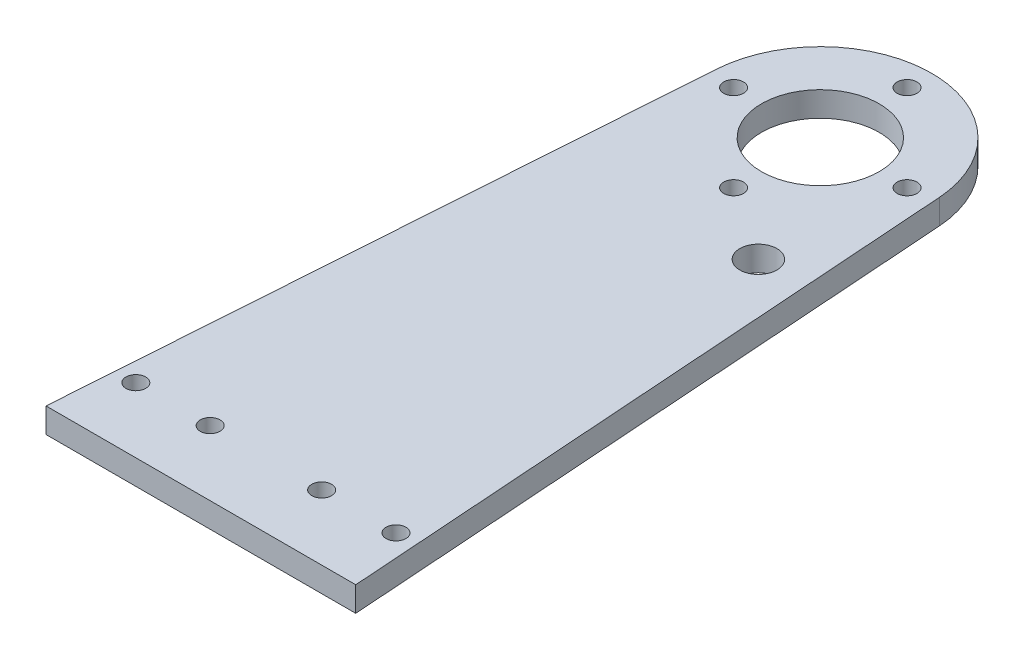
ISO-10303-21;
HEADER;
FILE_DESCRIPTION(('STEP AP214'),'2;1');
FILE_NAME('part.step','',(''),(''),'','','');
FILE_SCHEMA(('AUTOMOTIVE_DESIGN { 1 0 10303 214 1 1 1 1 }'));
ENDSEC;
DATA;
#1=APPLICATION_CONTEXT('core data for automotive mechanical design processes');
#2=APPLICATION_PROTOCOL_DEFINITION('international standard','automotive_design',2000,#1);
#3=PRODUCT_CONTEXT('',#1,'mechanical');
#4=PRODUCT('Part','Part','',(#3));
#5=PRODUCT_RELATED_PRODUCT_CATEGORY('part','',(#4));
#6=PRODUCT_DEFINITION_FORMATION('','',#4);
#7=PRODUCT_DEFINITION_CONTEXT('part definition',#1,'design');
#8=PRODUCT_DEFINITION('design','',#6,#7);
#9=PRODUCT_DEFINITION_SHAPE('','',#8);
#10=(LENGTH_UNIT() NAMED_UNIT(*) SI_UNIT(.MILLI.,.METRE.));
#11=(NAMED_UNIT(*) PLANE_ANGLE_UNIT() SI_UNIT($,.RADIAN.));
#12=(NAMED_UNIT(*) SI_UNIT($,.STERADIAN.) SOLID_ANGLE_UNIT());
#13=UNCERTAINTY_MEASURE_WITH_UNIT(LENGTH_MEASURE(1.E-05),#10,'distance_accuracy_value','');
#14=(GEOMETRIC_REPRESENTATION_CONTEXT(3) GLOBAL_UNCERTAINTY_ASSIGNED_CONTEXT((#13)) GLOBAL_UNIT_ASSIGNED_CONTEXT((#10,
#11,#12)) REPRESENTATION_CONTEXT('',''));
#15=CARTESIAN_POINT('',(0.,0.,0.));
#16=DIRECTION('',(0.,0.,1.));
#17=DIRECTION('',(1.,0.,0.));
#18=AXIS2_PLACEMENT_3D('',#15,#16,#17);
#19=CARTESIAN_POINT('',(0.,4.,0.));
#20=DIRECTION('',(0.,1.,0.));
#21=DIRECTION('',(0.,0.,1.));
#22=AXIS2_PLACEMENT_3D('',#19,#20,#21);
#23=PLANE('',#22);
#24=CARTESIAN_POINT('',(-9.00000000000125,4.,89.5));
#25=DIRECTION('',(0.,1.,0.));
#26=DIRECTION('',(0.,0.,1.));
#27=AXIS2_PLACEMENT_3D('',#24,#25,#26);
#28=CIRCLE('',#27,1.59999999999982);
#29=CARTESIAN_POINT('',(-9.00000000000125,4.,91.0999999999999));
#30=VERTEX_POINT('',#29);
#31=EDGE_CURVE('E158',#30,#30,#28,.T.);
#32=ORIENTED_EDGE('',*,*,#31,.F.);
#33=EDGE_LOOP('',(#32));
#34=FACE_BOUND('',#33,.T.);
#35=CARTESIAN_POINT('',(20.9999999999977,4.,89.5));
#36=DIRECTION('',(0.,1.,0.));
#37=DIRECTION('',(0.,0.,1.));
#38=AXIS2_PLACEMENT_3D('',#35,#36,#37);
#39=CIRCLE('',#38,1.59999999999982);
#40=CARTESIAN_POINT('',(20.9999999999977,4.,91.0999999999999));
#41=VERTEX_POINT('',#40);
#42=EDGE_CURVE('E146',#41,#41,#39,.T.);
#43=ORIENTED_EDGE('',*,*,#42,.F.);
#44=EDGE_LOOP('',(#43));
#45=FACE_BOUND('',#44,.T.);
#46=CARTESIAN_POINT('',(-1.34766330039948E-12,4.,-14.));
#47=DIRECTION('',(0.,1.,0.));
#48=DIRECTION('',(0.,0.,1.));
#49=AXIS2_PLACEMENT_3D('',#46,#47,#48);
#50=CIRCLE('',#49,1.59999999999982);
#51=CARTESIAN_POINT('',(-1.34766330039948E-12,4.,-12.4000000000002));
#52=VERTEX_POINT('',#51);
#53=EDGE_CURVE('E134',#52,#52,#50,.T.);
#54=ORIENTED_EDGE('',*,*,#53,.F.);
#55=EDGE_LOOP('',(#54));
#56=FACE_BOUND('',#55,.T.);
#57=CARTESIAN_POINT('',(-4.59484880699357E-13,4.,14.));
#58=DIRECTION('',(0.,1.,0.));
#59=DIRECTION('',(0.,0.,1.));
#60=AXIS2_PLACEMENT_3D('',#57,#58,#59);
#61=CIRCLE('',#60,1.59999999999982);
#62=CARTESIAN_POINT('',(-4.59484880699357E-13,4.,15.5999999999998));
#63=VERTEX_POINT('',#62);
#64=EDGE_CURVE('E122',#63,#63,#61,.T.);
#65=ORIENTED_EDGE('',*,*,#64,.F.);
#66=EDGE_LOOP('',(#65));
#67=FACE_BOUND('',#66,.T.);
#68=CARTESIAN_POINT('',(0.,4.,0.));
#69=DIRECTION('',(0.,1.,0.));
#70=DIRECTION('',(0.,0.,1.));
#71=AXIS2_PLACEMENT_3D('',#68,#69,#70);
#72=CIRCLE('',#71,9.49999999999872);
#73=CARTESIAN_POINT('',(0.,4.,9.49999999999872));
#74=VERTEX_POINT('',#73);
#75=EDGE_CURVE('E101',#74,#74,#72,.T.);
#76=ORIENTED_EDGE('',*,*,#75,.F.);
#77=EDGE_LOOP('',(#76));
#78=FACE_BOUND('',#77,.T.);
#79=CARTESIAN_POINT('',(0.,4.,0.));
#80=DIRECTION('',(0.,1.,0.));
#81=DIRECTION('',(0.,0.,1.));
#82=AXIS2_PLACEMENT_3D('',#79,#80,#81);
#83=CIRCLE('',#82,18.000000000004);
#84=CARTESIAN_POINT('',(17.9566038512915,4.,-1.2491509628253));
#85=VERTEX_POINT('',#84);
#86=CARTESIAN_POINT('',(-17.9566038512915,4.,-1.24915096282486));
#87=VERTEX_POINT('',#86);
#88=EDGE_CURVE('E86',#85,#87,#83,.T.);
#89=ORIENTED_EDGE('',*,*,#88,.T.);
#90=DIRECTION('',(-0.0693972757123029,0.,0.99758910284932));
#91=VECTOR('',#90,1.);
#92=CARTESIAN_POINT('',(-17.9566038512915,4.,-1.24915096282486));
#93=LINE('',#92,#91);
#94=CARTESIAN_POINT('',(-25.0000000000013,4.,99.9999999999996));
#95=VERTEX_POINT('',#94);
#96=EDGE_CURVE('E81',#87,#95,#93,.T.);
#97=ORIENTED_EDGE('',*,*,#96,.T.);
#98=DIRECTION('',(1.,0.,0.));
#99=VECTOR('',#98,1.);
#100=CARTESIAN_POINT('',(-25.0000000000013,4.,99.9999999999996));
#101=LINE('',#100,#99);
#102=CARTESIAN_POINT('',(24.9999999999995,4.,99.9999999999996));
#103=VERTEX_POINT('',#102);
#104=EDGE_CURVE('E84',#95,#103,#101,.T.);
#105=ORIENTED_EDGE('',*,*,#104,.T.);
#106=DIRECTION('',(-0.0693972757122852,0.,-0.997589102849321));
#107=VECTOR('',#106,1.);
#108=CARTESIAN_POINT('',(17.9566038512915,4.,-1.2491509628253));
#109=LINE('',#108,#107);
#110=EDGE_CURVE('E51',#103,#85,#109,.T.);
#111=ORIENTED_EDGE('',*,*,#110,.T.);
#112=EDGE_LOOP('',(#89,#97,#105,#111));
#113=FACE_BOUND('',#112,.T.);
#114=CARTESIAN_POINT('',(-14.0000000000007,4.,4.37150315946155E-13));
#115=DIRECTION('',(0.,1.,0.));
#116=DIRECTION('',(0.,0.,1.));
#117=AXIS2_PLACEMENT_3D('',#114,#115,#116);
#118=CIRCLE('',#117,1.59999999999982);
#119=CARTESIAN_POINT('',(-14.0000000000007,4.,1.60000000000026));
#120=VERTEX_POINT('',#119);
#121=EDGE_CURVE('E116',#120,#120,#118,.T.);
#122=ORIENTED_EDGE('',*,*,#121,.F.);
#123=EDGE_LOOP('',(#122));
#124=FACE_BOUND('',#123,.T.);
#125=CARTESIAN_POINT('',(13.9999999999993,4.,-4.5102810375397E-13));
#126=DIRECTION('',(0.,1.,0.));
#127=DIRECTION('',(0.,0.,1.));
#128=AXIS2_PLACEMENT_3D('',#125,#126,#127);
#129=CIRCLE('',#128,1.59999999999982);
#130=CARTESIAN_POINT('',(13.9999999999993,4.,1.59999999999937));
#131=VERTEX_POINT('',#130);
#132=EDGE_CURVE('E128',#131,#131,#129,.T.);
#133=ORIENTED_EDGE('',*,*,#132,.F.);
#134=EDGE_LOOP('',(#133));
#135=FACE_BOUND('',#134,.T.);
#136=CARTESIAN_POINT('',(8.99999999999944,4.,89.5));
#137=DIRECTION('',(0.,1.,0.));
#138=DIRECTION('',(0.,0.,1.));
#139=AXIS2_PLACEMENT_3D('',#136,#137,#138);
#140=CIRCLE('',#139,1.59999999999982);
#141=CARTESIAN_POINT('',(8.99999999999944,4.,91.0999999999999));
#142=VERTEX_POINT('',#141);
#143=EDGE_CURVE('E140',#142,#142,#140,.T.);
#144=ORIENTED_EDGE('',*,*,#143,.F.);
#145=EDGE_LOOP('',(#144));
#146=FACE_BOUND('',#145,.T.);
#147=CARTESIAN_POINT('',(-21.0000000000021,4.,89.5));
#148=DIRECTION('',(0.,1.,0.));
#149=DIRECTION('',(0.,0.,1.));
#150=AXIS2_PLACEMENT_3D('',#147,#148,#149);
#151=CIRCLE('',#150,1.59999999999982);
#152=CARTESIAN_POINT('',(-21.0000000000021,4.,91.0999999999999));
#153=VERTEX_POINT('',#152);
#154=EDGE_CURVE('E152',#153,#153,#151,.T.);
#155=ORIENTED_EDGE('',*,*,#154,.F.);
#156=EDGE_LOOP('',(#155));
#157=FACE_BOUND('',#156,.T.);
#158=CARTESIAN_POINT('',(11.9999999999996,4.,22.));
#159=DIRECTION('',(0.,1.,0.));
#160=DIRECTION('',(0.,0.,1.));
#161=AXIS2_PLACEMENT_3D('',#158,#159,#160);
#162=CIRCLE('',#161,3.00000000000011);
#163=CARTESIAN_POINT('',(11.9999999999996,4.,25.0000000000001));
#164=VERTEX_POINT('',#163);
#165=EDGE_CURVE('E164',#164,#164,#162,.T.);
#166=ORIENTED_EDGE('',*,*,#165,.F.);
#167=EDGE_LOOP('',(#166));
#168=FACE_BOUND('',#167,.T.);
#169=ADVANCED_FACE('F34',(#34,#45,#56,#67,#78,#113,#124,#135,#146,#157,#168),#23,.T.);
#170=CARTESIAN_POINT('',(0.,0.,0.));
#171=DIRECTION('',(0.,1.,0.));
#172=DIRECTION('',(0.,0.,1.));
#173=AXIS2_PLACEMENT_3D('',#170,#171,#172);
#174=PLANE('',#173);
#175=CARTESIAN_POINT('',(0.,0.,0.));
#176=DIRECTION('',(0.,1.,0.));
#177=DIRECTION('',(0.,0.,1.));
#178=AXIS2_PLACEMENT_3D('',#175,#176,#177);
#179=CIRCLE('',#178,18.000000000004);
#180=CARTESIAN_POINT('',(17.9566038512915,0.,-1.2491509628253));
#181=VERTEX_POINT('',#180);
#182=CARTESIAN_POINT('',(-17.9566038512915,0.,-1.24915096282486));
#183=VERTEX_POINT('',#182);
#184=EDGE_CURVE('E98',#181,#183,#179,.T.);
#185=ORIENTED_EDGE('',*,*,#184,.F.);
#186=DIRECTION('',(-0.0693972757122852,0.,-0.997589102849321));
#187=VECTOR('',#186,1.);
#188=CARTESIAN_POINT('',(17.9566038512915,0.,-1.2491509628253));
#189=LINE('',#188,#187);
#190=CARTESIAN_POINT('',(24.9999999999995,0.,99.9999999999996));
#191=VERTEX_POINT('',#190);
#192=EDGE_CURVE('E74',#191,#181,#189,.T.);
#193=ORIENTED_EDGE('',*,*,#192,.F.);
#194=DIRECTION('',(1.,0.,0.));
#195=VECTOR('',#194,1.);
#196=CARTESIAN_POINT('',(-25.0000000000013,0.,99.9999999999996));
#197=LINE('',#196,#195);
#198=CARTESIAN_POINT('',(-25.0000000000013,0.,99.9999999999996));
#199=VERTEX_POINT('',#198);
#200=EDGE_CURVE('E68',#199,#191,#197,.T.);
#201=ORIENTED_EDGE('',*,*,#200,.F.);
#202=DIRECTION('',(-0.0693972757123029,0.,0.99758910284932));
#203=VECTOR('',#202,1.);
#204=CARTESIAN_POINT('',(-17.9566038512915,0.,-1.24915096282486));
#205=LINE('',#204,#203);
#206=EDGE_CURVE('E90',#183,#199,#205,.T.);
#207=ORIENTED_EDGE('',*,*,#206,.F.);
#208=EDGE_LOOP('',(#185,#193,#201,#207));
#209=FACE_BOUND('',#208,.T.);
#210=CARTESIAN_POINT('',(0.,0.,0.));
#211=DIRECTION('',(0.,1.,0.));
#212=DIRECTION('',(0.,0.,1.));
#213=AXIS2_PLACEMENT_3D('',#210,#211,#212);
#214=CIRCLE('',#213,9.49999999999872);
#215=CARTESIAN_POINT('',(0.,0.,9.49999999999872));
#216=VERTEX_POINT('',#215);
#217=EDGE_CURVE('E113',#216,#216,#214,.T.);
#218=ORIENTED_EDGE('',*,*,#217,.T.);
#219=EDGE_LOOP('',(#218));
#220=FACE_BOUND('',#219,.T.);
#221=CARTESIAN_POINT('',(-14.0000000000007,0.,4.37150315946155E-13));
#222=DIRECTION('',(0.,1.,0.));
#223=DIRECTION('',(0.,0.,1.));
#224=AXIS2_PLACEMENT_3D('',#221,#222,#223);
#225=CIRCLE('',#224,1.59999999999982);
#226=CARTESIAN_POINT('',(-14.0000000000007,0.,1.60000000000026));
#227=VERTEX_POINT('',#226);
#228=EDGE_CURVE('E119',#227,#227,#225,.T.);
#229=ORIENTED_EDGE('',*,*,#228,.T.);
#230=EDGE_LOOP('',(#229));
#231=FACE_BOUND('',#230,.T.);
#232=CARTESIAN_POINT('',(-4.59484880699357E-13,0.,14.));
#233=DIRECTION('',(0.,1.,0.));
#234=DIRECTION('',(0.,0.,1.));
#235=AXIS2_PLACEMENT_3D('',#232,#233,#234);
#236=CIRCLE('',#235,1.59999999999982);
#237=CARTESIAN_POINT('',(-4.59484880699357E-13,0.,15.5999999999998));
#238=VERTEX_POINT('',#237);
#239=EDGE_CURVE('E125',#238,#238,#236,.T.);
#240=ORIENTED_EDGE('',*,*,#239,.T.);
#241=EDGE_LOOP('',(#240));
#242=FACE_BOUND('',#241,.T.);
#243=CARTESIAN_POINT('',(13.9999999999993,0.,-4.5102810375397E-13));
#244=DIRECTION('',(0.,1.,0.));
#245=DIRECTION('',(0.,0.,1.));
#246=AXIS2_PLACEMENT_3D('',#243,#244,#245);
#247=CIRCLE('',#246,1.59999999999982);
#248=CARTESIAN_POINT('',(13.9999999999993,0.,1.59999999999937));
#249=VERTEX_POINT('',#248);
#250=EDGE_CURVE('E131',#249,#249,#247,.T.);
#251=ORIENTED_EDGE('',*,*,#250,.T.);
#252=EDGE_LOOP('',(#251));
#253=FACE_BOUND('',#252,.T.);
#254=CARTESIAN_POINT('',(-1.34766330039948E-12,0.,-14.));
#255=DIRECTION('',(0.,1.,0.));
#256=DIRECTION('',(0.,0.,1.));
#257=AXIS2_PLACEMENT_3D('',#254,#255,#256);
#258=CIRCLE('',#257,1.59999999999982);
#259=CARTESIAN_POINT('',(-1.34766330039948E-12,0.,-12.4000000000002));
#260=VERTEX_POINT('',#259);
#261=EDGE_CURVE('E137',#260,#260,#258,.T.);
#262=ORIENTED_EDGE('',*,*,#261,.T.);
#263=EDGE_LOOP('',(#262));
#264=FACE_BOUND('',#263,.T.);
#265=CARTESIAN_POINT('',(8.99999999999944,0.,89.5));
#266=DIRECTION('',(0.,1.,0.));
#267=DIRECTION('',(0.,0.,1.));
#268=AXIS2_PLACEMENT_3D('',#265,#266,#267);
#269=CIRCLE('',#268,1.59999999999982);
#270=CARTESIAN_POINT('',(8.99999999999944,0.,91.0999999999999));
#271=VERTEX_POINT('',#270);
#272=EDGE_CURVE('E143',#271,#271,#269,.T.);
#273=ORIENTED_EDGE('',*,*,#272,.T.);
#274=EDGE_LOOP('',(#273));
#275=FACE_BOUND('',#274,.T.);
#276=CARTESIAN_POINT('',(20.9999999999977,0.,89.5));
#277=DIRECTION('',(0.,1.,0.));
#278=DIRECTION('',(0.,0.,1.));
#279=AXIS2_PLACEMENT_3D('',#276,#277,#278);
#280=CIRCLE('',#279,1.59999999999982);
#281=CARTESIAN_POINT('',(20.9999999999977,0.,91.0999999999999));
#282=VERTEX_POINT('',#281);
#283=EDGE_CURVE('E149',#282,#282,#280,.T.);
#284=ORIENTED_EDGE('',*,*,#283,.T.);
#285=EDGE_LOOP('',(#284));
#286=FACE_BOUND('',#285,.T.);
#287=CARTESIAN_POINT('',(-21.0000000000021,0.,89.5));
#288=DIRECTION('',(0.,1.,0.));
#289=DIRECTION('',(0.,0.,1.));
#290=AXIS2_PLACEMENT_3D('',#287,#288,#289);
#291=CIRCLE('',#290,1.59999999999982);
#292=CARTESIAN_POINT('',(-21.0000000000021,0.,91.0999999999999));
#293=VERTEX_POINT('',#292);
#294=EDGE_CURVE('E155',#293,#293,#291,.T.);
#295=ORIENTED_EDGE('',*,*,#294,.T.);
#296=EDGE_LOOP('',(#295));
#297=FACE_BOUND('',#296,.T.);
#298=CARTESIAN_POINT('',(-9.00000000000125,0.,89.5));
#299=DIRECTION('',(0.,1.,0.));
#300=DIRECTION('',(0.,0.,1.));
#301=AXIS2_PLACEMENT_3D('',#298,#299,#300);
#302=CIRCLE('',#301,1.59999999999982);
#303=CARTESIAN_POINT('',(-9.00000000000125,0.,91.0999999999999));
#304=VERTEX_POINT('',#303);
#305=EDGE_CURVE('E161',#304,#304,#302,.T.);
#306=ORIENTED_EDGE('',*,*,#305,.T.);
#307=EDGE_LOOP('',(#306));
#308=FACE_BOUND('',#307,.T.);
#309=CARTESIAN_POINT('',(11.9999999999996,0.,22.));
#310=DIRECTION('',(0.,1.,0.));
#311=DIRECTION('',(0.,0.,1.));
#312=AXIS2_PLACEMENT_3D('',#309,#310,#311);
#313=CIRCLE('',#312,3.00000000000011);
#314=CARTESIAN_POINT('',(11.9999999999996,0.,25.0000000000001));
#315=VERTEX_POINT('',#314);
#316=EDGE_CURVE('E167',#315,#315,#313,.T.);
#317=ORIENTED_EDGE('',*,*,#316,.T.);
#318=EDGE_LOOP('',(#317));
#319=FACE_BOUND('',#318,.T.);
#320=ADVANCED_FACE('F109',(#209,#220,#231,#242,#253,#264,#275,#286,#297,#308,#319),#174,.F.);
#321=CARTESIAN_POINT('',(0.,4.,0.));
#322=DIRECTION('',(0.,-1.,0.));
#323=DIRECTION('',(0.,0.,-1.));
#324=AXIS2_PLACEMENT_3D('',#321,#322,#323);
#325=CYLINDRICAL_SURFACE('',#324,18.000000000004);
#326=ORIENTED_EDGE('',*,*,#184,.T.);
#327=DIRECTION('',(0.,-1.,0.));
#328=VECTOR('',#327,1.);
#329=CARTESIAN_POINT('',(-17.9566038512915,4.,-1.24915096282486));
#330=LINE('',#329,#328);
#331=EDGE_CURVE('E11',#87,#183,#330,.T.);
#332=ORIENTED_EDGE('',*,*,#331,.F.);
#333=ORIENTED_EDGE('',*,*,#88,.F.);
#334=DIRECTION('',(0.,-1.,0.));
#335=VECTOR('',#334,1.);
#336=CARTESIAN_POINT('',(17.9566038512915,4.,-1.2491509628253));
#337=LINE('',#336,#335);
#338=EDGE_CURVE('E94',#85,#181,#337,.T.);
#339=ORIENTED_EDGE('',*,*,#338,.T.);
#340=EDGE_LOOP('',(#326,#332,#333,#339));
#341=FACE_BOUND('',#340,.T.);
#342=ADVANCED_FACE('F36',(#341),#325,.T.);
#343=CARTESIAN_POINT('',(-17.9566038512915,4.,-1.24915096282486));
#344=DIRECTION('',(0.99758910284932,0.,0.0693972757123029));
#345=DIRECTION('',(0.0693972757123029,0.,-0.99758910284932));
#346=AXIS2_PLACEMENT_3D('',#343,#344,#345);
#347=PLANE('',#346);
#348=ORIENTED_EDGE('',*,*,#206,.T.);
#349=DIRECTION('',(0.,-1.,0.));
#350=VECTOR('',#349,1.);
#351=CARTESIAN_POINT('',(-25.0000000000013,4.,99.9999999999996));
#352=LINE('',#351,#350);
#353=EDGE_CURVE('E43',#95,#199,#352,.T.);
#354=ORIENTED_EDGE('',*,*,#353,.F.);
#355=ORIENTED_EDGE('',*,*,#96,.F.);
#356=ORIENTED_EDGE('',*,*,#331,.T.);
#357=EDGE_LOOP('',(#348,#354,#355,#356));
#358=FACE_BOUND('',#357,.T.);
#359=ADVANCED_FACE('F89',(#358),#347,.F.);
#360=CARTESIAN_POINT('',(-25.0000000000013,4.,99.9999999999996));
#361=DIRECTION('',(0.,0.,-1.));
#362=DIRECTION('',(-1.,0.,0.));
#363=AXIS2_PLACEMENT_3D('',#360,#361,#362);
#364=PLANE('',#363);
#365=ORIENTED_EDGE('',*,*,#200,.T.);
#366=DIRECTION('',(0.,-1.,0.));
#367=VECTOR('',#366,1.);
#368=CARTESIAN_POINT('',(24.9999999999995,4.,99.9999999999996));
#369=LINE('',#368,#367);
#370=EDGE_CURVE('E91',#103,#191,#369,.T.);
#371=ORIENTED_EDGE('',*,*,#370,.F.);
#372=ORIENTED_EDGE('',*,*,#104,.F.);
#373=ORIENTED_EDGE('',*,*,#353,.T.);
#374=EDGE_LOOP('',(#365,#371,#372,#373));
#375=FACE_BOUND('',#374,.T.);
#376=ADVANCED_FACE('F92',(#375),#364,.F.);
#377=CARTESIAN_POINT('',(17.9566038512915,4.,-1.2491509628253));
#378=DIRECTION('',(-0.997589102849321,0.,0.0693972757122852));
#379=DIRECTION('',(0.0693972757122852,0.,0.997589102849321));
#380=AXIS2_PLACEMENT_3D('',#377,#378,#379);
#381=PLANE('',#380);
#382=ORIENTED_EDGE('',*,*,#192,.T.);
#383=ORIENTED_EDGE('',*,*,#338,.F.);
#384=ORIENTED_EDGE('',*,*,#110,.F.);
#385=ORIENTED_EDGE('',*,*,#370,.T.);
#386=EDGE_LOOP('',(#382,#383,#384,#385));
#387=FACE_BOUND('',#386,.T.);
#388=ADVANCED_FACE('F106',(#387),#381,.F.);
#389=CARTESIAN_POINT('',(0.,4.,0.));
#390=DIRECTION('',(0.,-1.,0.));
#391=DIRECTION('',(0.,0.,-1.));
#392=AXIS2_PLACEMENT_3D('',#389,#390,#391);
#393=CYLINDRICAL_SURFACE('',#392,9.49999999999872);
#394=ORIENTED_EDGE('',*,*,#75,.T.);
#395=EDGE_LOOP('',(#394));
#396=FACE_BOUND('',#395,.T.);
#397=ORIENTED_EDGE('',*,*,#217,.F.);
#398=EDGE_LOOP('',(#397));
#399=FACE_BOUND('',#398,.T.);
#400=ADVANCED_FACE('F186',(#396,#399),#393,.F.);
#401=CARTESIAN_POINT('',(-14.0000000000007,4.,4.37150315946155E-13));
#402=DIRECTION('',(0.,-1.,0.));
#403=DIRECTION('',(0.,0.,-1.));
#404=AXIS2_PLACEMENT_3D('',#401,#402,#403);
#405=CYLINDRICAL_SURFACE('',#404,1.59999999999982);
#406=ORIENTED_EDGE('',*,*,#121,.T.);
#407=EDGE_LOOP('',(#406));
#408=FACE_BOUND('',#407,.T.);
#409=ORIENTED_EDGE('',*,*,#228,.F.);
#410=EDGE_LOOP('',(#409));
#411=FACE_BOUND('',#410,.T.);
#412=ADVANCED_FACE('F232',(#408,#411),#405,.F.);
#413=CARTESIAN_POINT('',(-4.59484880699357E-13,4.,14.));
#414=DIRECTION('',(0.,-1.,0.));
#415=DIRECTION('',(0.,0.,-1.));
#416=AXIS2_PLACEMENT_3D('',#413,#414,#415);
#417=CYLINDRICAL_SURFACE('',#416,1.59999999999982);
#418=ORIENTED_EDGE('',*,*,#64,.T.);
#419=EDGE_LOOP('',(#418));
#420=FACE_BOUND('',#419,.T.);
#421=ORIENTED_EDGE('',*,*,#239,.F.);
#422=EDGE_LOOP('',(#421));
#423=FACE_BOUND('',#422,.T.);
#424=ADVANCED_FACE('F240',(#420,#423),#417,.F.);
#425=CARTESIAN_POINT('',(13.9999999999993,4.,-4.5102810375397E-13));
#426=DIRECTION('',(0.,-1.,0.));
#427=DIRECTION('',(0.,0.,-1.));
#428=AXIS2_PLACEMENT_3D('',#425,#426,#427);
#429=CYLINDRICAL_SURFACE('',#428,1.59999999999982);
#430=ORIENTED_EDGE('',*,*,#132,.T.);
#431=EDGE_LOOP('',(#430));
#432=FACE_BOUND('',#431,.T.);
#433=ORIENTED_EDGE('',*,*,#250,.F.);
#434=EDGE_LOOP('',(#433));
#435=FACE_BOUND('',#434,.T.);
#436=ADVANCED_FACE('F248',(#432,#435),#429,.F.);
#437=CARTESIAN_POINT('',(-1.34766330039948E-12,4.,-14.));
#438=DIRECTION('',(0.,-1.,0.));
#439=DIRECTION('',(0.,0.,-1.));
#440=AXIS2_PLACEMENT_3D('',#437,#438,#439);
#441=CYLINDRICAL_SURFACE('',#440,1.59999999999982);
#442=ORIENTED_EDGE('',*,*,#53,.T.);
#443=EDGE_LOOP('',(#442));
#444=FACE_BOUND('',#443,.T.);
#445=ORIENTED_EDGE('',*,*,#261,.F.);
#446=EDGE_LOOP('',(#445));
#447=FACE_BOUND('',#446,.T.);
#448=ADVANCED_FACE('F257',(#444,#447),#441,.F.);
#449=CARTESIAN_POINT('',(8.99999999999944,4.,89.5));
#450=DIRECTION('',(0.,-1.,0.));
#451=DIRECTION('',(0.,0.,-1.));
#452=AXIS2_PLACEMENT_3D('',#449,#450,#451);
#453=CYLINDRICAL_SURFACE('',#452,1.59999999999982);
#454=ORIENTED_EDGE('',*,*,#143,.T.);
#455=EDGE_LOOP('',(#454));
#456=FACE_BOUND('',#455,.T.);
#457=ORIENTED_EDGE('',*,*,#272,.F.);
#458=EDGE_LOOP('',(#457));
#459=FACE_BOUND('',#458,.T.);
#460=ADVANCED_FACE('F266',(#456,#459),#453,.F.);
#461=CARTESIAN_POINT('',(20.9999999999977,4.,89.5));
#462=DIRECTION('',(0.,-1.,0.));
#463=DIRECTION('',(0.,0.,-1.));
#464=AXIS2_PLACEMENT_3D('',#461,#462,#463);
#465=CYLINDRICAL_SURFACE('',#464,1.59999999999982);
#466=ORIENTED_EDGE('',*,*,#42,.T.);
#467=EDGE_LOOP('',(#466));
#468=FACE_BOUND('',#467,.T.);
#469=ORIENTED_EDGE('',*,*,#283,.F.);
#470=EDGE_LOOP('',(#469));
#471=FACE_BOUND('',#470,.T.);
#472=ADVANCED_FACE('F275',(#468,#471),#465,.F.);
#473=CARTESIAN_POINT('',(-21.0000000000021,4.,89.5));
#474=DIRECTION('',(0.,-1.,0.));
#475=DIRECTION('',(0.,0.,-1.));
#476=AXIS2_PLACEMENT_3D('',#473,#474,#475);
#477=CYLINDRICAL_SURFACE('',#476,1.59999999999982);
#478=ORIENTED_EDGE('',*,*,#154,.T.);
#479=EDGE_LOOP('',(#478));
#480=FACE_BOUND('',#479,.T.);
#481=ORIENTED_EDGE('',*,*,#294,.F.);
#482=EDGE_LOOP('',(#481));
#483=FACE_BOUND('',#482,.T.);
#484=ADVANCED_FACE('F284',(#480,#483),#477,.F.);
#485=CARTESIAN_POINT('',(-9.00000000000125,4.,89.5));
#486=DIRECTION('',(0.,-1.,0.));
#487=DIRECTION('',(0.,0.,-1.));
#488=AXIS2_PLACEMENT_3D('',#485,#486,#487);
#489=CYLINDRICAL_SURFACE('',#488,1.59999999999982);
#490=ORIENTED_EDGE('',*,*,#31,.T.);
#491=EDGE_LOOP('',(#490));
#492=FACE_BOUND('',#491,.T.);
#493=ORIENTED_EDGE('',*,*,#305,.F.);
#494=EDGE_LOOP('',(#493));
#495=FACE_BOUND('',#494,.T.);
#496=ADVANCED_FACE('F293',(#492,#495),#489,.F.);
#497=CARTESIAN_POINT('',(11.9999999999996,4.,22.));
#498=DIRECTION('',(0.,-1.,0.));
#499=DIRECTION('',(0.,0.,-1.));
#500=AXIS2_PLACEMENT_3D('',#497,#498,#499);
#501=CYLINDRICAL_SURFACE('',#500,3.00000000000011);
#502=ORIENTED_EDGE('',*,*,#165,.T.);
#503=EDGE_LOOP('',(#502));
#504=FACE_BOUND('',#503,.T.);
#505=ORIENTED_EDGE('',*,*,#316,.F.);
#506=EDGE_LOOP('',(#505));
#507=FACE_BOUND('',#506,.T.);
#508=ADVANCED_FACE('F173',(#504,#507),#501,.F.);
#509=CLOSED_SHELL('',(#169,#320,#342,#359,#376,#388,#400,#412,#424,#436,#448,#460,#472,#484,
#496,#508));
#510=MANIFOLD_SOLID_BREP('B2',#509);
#511=ADVANCED_BREP_SHAPE_REPRESENTATION('',(#18,#510),#14);
#512=SHAPE_DEFINITION_REPRESENTATION(#9,#511);
ENDSEC;
END-ISO-10303-21;
